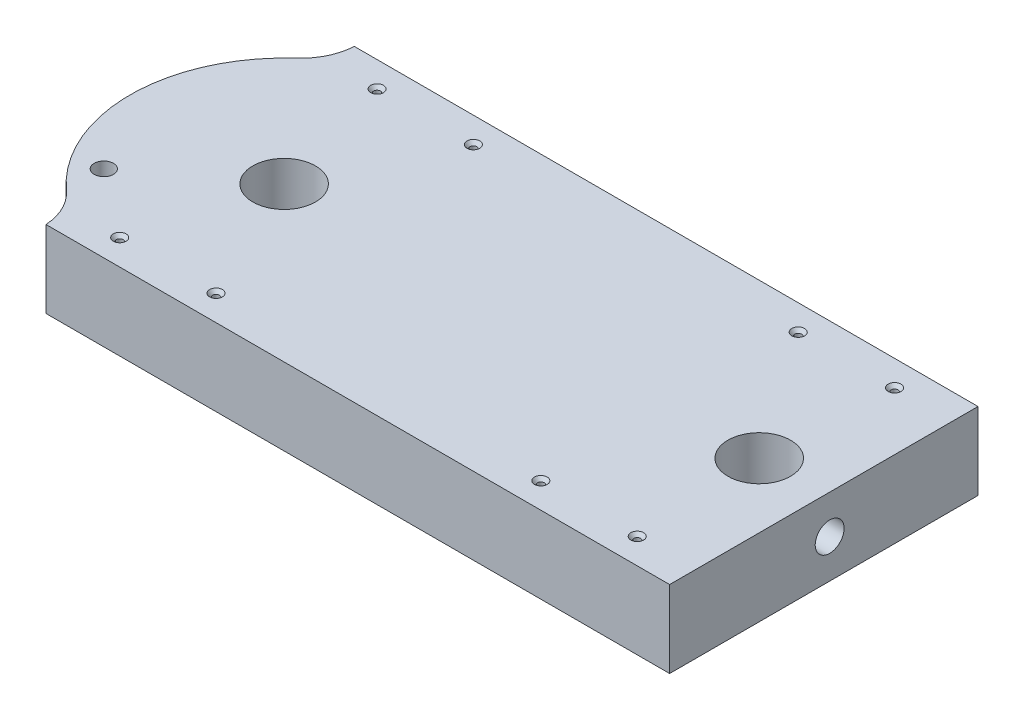
ISO-10303-21;
HEADER;
FILE_DESCRIPTION(('STEP AP214'),'2;1');
FILE_NAME('part.step','',(''),(''),'','','');
FILE_SCHEMA(('AUTOMOTIVE_DESIGN { 1 0 10303 214 1 1 1 1 }'));
ENDSEC;
DATA;
#1=APPLICATION_CONTEXT('core data for automotive mechanical design processes');
#2=APPLICATION_PROTOCOL_DEFINITION('international standard','automotive_design',2000,#1);
#3=PRODUCT_CONTEXT('',#1,'mechanical');
#4=PRODUCT('Part','Part','',(#3));
#5=PRODUCT_RELATED_PRODUCT_CATEGORY('part','',(#4));
#6=PRODUCT_DEFINITION_FORMATION('','',#4);
#7=PRODUCT_DEFINITION_CONTEXT('part definition',#1,'design');
#8=PRODUCT_DEFINITION('design','',#6,#7);
#9=PRODUCT_DEFINITION_SHAPE('','',#8);
#10=(LENGTH_UNIT() NAMED_UNIT(*) SI_UNIT(.MILLI.,.METRE.));
#11=(NAMED_UNIT(*) PLANE_ANGLE_UNIT() SI_UNIT($,.RADIAN.));
#12=(NAMED_UNIT(*) SI_UNIT($,.STERADIAN.) SOLID_ANGLE_UNIT());
#13=UNCERTAINTY_MEASURE_WITH_UNIT(LENGTH_MEASURE(1.E-05),#10,'distance_accuracy_value','');
#14=(GEOMETRIC_REPRESENTATION_CONTEXT(3) GLOBAL_UNCERTAINTY_ASSIGNED_CONTEXT((#13)) GLOBAL_UNIT_ASSIGNED_CONTEXT((#10,
#11,#12)) REPRESENTATION_CONTEXT('',''));
#15=CARTESIAN_POINT('',(0.,0.,0.));
#16=DIRECTION('',(0.,0.,1.));
#17=DIRECTION('',(1.,0.,0.));
#18=AXIS2_PLACEMENT_3D('',#15,#16,#17);
#19=CARTESIAN_POINT('',(-448.948604797529,50.8,205.533286209736));
#20=DIRECTION('',(0.,-1.,0.));
#21=DIRECTION('',(0.,0.,-1.));
#22=AXIS2_PLACEMENT_3D('',#19,#20,#21);
#23=CYLINDRICAL_SURFACE('',#22,38.1);
#24=CARTESIAN_POINT('',(-448.948604797529,0.,205.533286209736));
#25=DIRECTION('',(0.,1.,0.));
#26=DIRECTION('',(0.,0.,1.));
#27=AXIS2_PLACEMENT_3D('',#24,#25,#26);
#28=CIRCLE('',#27,38.1);
#29=CARTESIAN_POINT('',(-410.920118429236,0.,203.2));
#30=VERTEX_POINT('',#29);
#31=CARTESIAN_POINT('',(-423.489894398203,0.,177.187844516171));
#32=VERTEX_POINT('',#31);
#33=EDGE_CURVE('E126',#30,#32,#28,.T.);
#34=ORIENTED_EDGE('',*,*,#33,.F.);
#35=DIRECTION('',(0.,-1.,0.));
#36=VECTOR('',#35,1.);
#37=CARTESIAN_POINT('',(-410.920118429236,50.8,203.2));
#38=LINE('',#37,#36);
#39=CARTESIAN_POINT('',(-410.920118429236,50.8,203.2));
#40=VERTEX_POINT('',#39);
#41=EDGE_CURVE('E11',#40,#30,#38,.T.);
#42=ORIENTED_EDGE('',*,*,#41,.F.);
#43=CARTESIAN_POINT('',(-448.948604797529,50.8,205.533286209736));
#44=DIRECTION('',(0.,1.,0.));
#45=DIRECTION('',(0.,0.,1.));
#46=AXIS2_PLACEMENT_3D('',#43,#44,#45);
#47=CIRCLE('',#46,38.1);
#48=CARTESIAN_POINT('',(-423.489894398203,50.8,177.187844516171));
#49=VERTEX_POINT('',#48);
#50=EDGE_CURVE('E141',#40,#49,#47,.T.);
#51=ORIENTED_EDGE('',*,*,#50,.T.);
#52=DIRECTION('',(0.,-1.,0.));
#53=VECTOR('',#52,1.);
#54=CARTESIAN_POINT('',(-423.489894398203,50.8,177.187844516171));
#55=LINE('',#54,#53);
#56=EDGE_CURVE('E89',#49,#32,#55,.T.);
#57=ORIENTED_EDGE('',*,*,#56,.T.);
#58=EDGE_LOOP('',(#34,#42,#51,#57));
#59=FACE_BOUND('',#58,.T.);
#60=ADVANCED_FACE('F39',(#59),#23,.F.);
#61=CARTESIAN_POINT('',(0.,50.8,203.2));
#62=DIRECTION('',(0.,0.,1.));
#63=DIRECTION('',(1.,0.,0.));
#64=AXIS2_PLACEMENT_3D('',#61,#62,#63);
#65=PLANE('',#64);
#66=DIRECTION('',(-1.,0.,0.));
#67=VECTOR('',#66,1.);
#68=CARTESIAN_POINT('',(0.,0.,203.2));
#69=LINE('',#68,#67);
#70=CARTESIAN_POINT('',(0.,0.,203.2));
#71=VERTEX_POINT('',#70);
#72=EDGE_CURVE('E129',#71,#30,#69,.T.);
#73=ORIENTED_EDGE('',*,*,#72,.F.);
#74=DIRECTION('',(0.,-1.,0.));
#75=VECTOR('',#74,1.);
#76=CARTESIAN_POINT('',(0.,50.8,203.2));
#77=LINE('',#76,#75);
#78=CARTESIAN_POINT('',(0.,50.8,203.2));
#79=VERTEX_POINT('',#78);
#80=EDGE_CURVE('E53',#79,#71,#77,.T.);
#81=ORIENTED_EDGE('',*,*,#80,.F.);
#82=DIRECTION('',(-1.,0.,0.));
#83=VECTOR('',#82,1.);
#84=CARTESIAN_POINT('',(0.,50.8,203.2));
#85=LINE('',#84,#83);
#86=EDGE_CURVE('E155',#79,#40,#85,.T.);
#87=ORIENTED_EDGE('',*,*,#86,.T.);
#88=ORIENTED_EDGE('',*,*,#41,.T.);
#89=EDGE_LOOP('',(#73,#81,#87,#88));
#90=FACE_BOUND('',#89,.T.);
#91=ADVANCED_FACE('F151',(#90),#65,.T.);
#92=CARTESIAN_POINT('',(0.,50.8,0.));
#93=DIRECTION('',(1.,0.,0.));
#94=DIRECTION('',(0.,0.,-1.));
#95=AXIS2_PLACEMENT_3D('',#92,#93,#94);
#96=PLANE('',#95);
#97=CARTESIAN_POINT('',(0.,25.4,97.7392));
#98=DIRECTION('',(1.,0.,0.));
#99=DIRECTION('',(0.,0.,-1.));
#100=AXIS2_PLACEMENT_3D('',#97,#98,#99);
#101=CIRCLE('',#100,9.525);
#102=CARTESIAN_POINT('',(0.,25.4,88.2142));
#103=VERTEX_POINT('',#102);
#104=EDGE_CURVE('E248',#103,#103,#101,.T.);
#105=ORIENTED_EDGE('',*,*,#104,.F.);
#106=EDGE_LOOP('',(#105));
#107=FACE_BOUND('',#106,.T.);
#108=DIRECTION('',(0.,0.,1.));
#109=VECTOR('',#108,1.);
#110=CARTESIAN_POINT('',(0.,0.,0.));
#111=LINE('',#110,#109);
#112=CARTESIAN_POINT('',(0.,0.,0.));
#113=VERTEX_POINT('',#112);
#114=EDGE_CURVE('E133',#113,#71,#111,.T.);
#115=ORIENTED_EDGE('',*,*,#114,.F.);
#116=DIRECTION('',(0.,-1.,0.));
#117=VECTOR('',#116,1.);
#118=CARTESIAN_POINT('',(0.,50.8,0.));
#119=LINE('',#118,#117);
#120=CARTESIAN_POINT('',(0.,50.8,0.));
#121=VERTEX_POINT('',#120);
#122=EDGE_CURVE('E119',#121,#113,#119,.T.);
#123=ORIENTED_EDGE('',*,*,#122,.F.);
#124=DIRECTION('',(0.,0.,1.));
#125=VECTOR('',#124,1.);
#126=CARTESIAN_POINT('',(0.,50.8,0.));
#127=LINE('',#126,#125);
#128=EDGE_CURVE('E108',#121,#79,#127,.T.);
#129=ORIENTED_EDGE('',*,*,#128,.T.);
#130=ORIENTED_EDGE('',*,*,#80,.T.);
#131=EDGE_LOOP('',(#115,#123,#129,#130));
#132=FACE_BOUND('',#131,.T.);
#133=ADVANCED_FACE('F148',(#107,#132),#96,.T.);
#134=CARTESIAN_POINT('',(0.,50.8,0.));
#135=DIRECTION('',(0.,0.,1.));
#136=DIRECTION('',(1.,0.,0.));
#137=AXIS2_PLACEMENT_3D('',#134,#135,#136);
#138=PLANE('',#137);
#139=DIRECTION('',(-1.,0.,0.));
#140=VECTOR('',#139,1.);
#141=CARTESIAN_POINT('',(0.,0.,0.));
#142=LINE('',#141,#140);
#143=CARTESIAN_POINT('',(-410.920118429236,0.,0.));
#144=VERTEX_POINT('',#143);
#145=EDGE_CURVE('E115',#113,#144,#142,.T.);
#146=ORIENTED_EDGE('',*,*,#145,.T.);
#147=DIRECTION('',(0.,-1.,0.));
#148=VECTOR('',#147,1.);
#149=CARTESIAN_POINT('',(-410.920118429236,50.8,0.));
#150=LINE('',#149,#148);
#151=CARTESIAN_POINT('',(-410.920118429236,50.8,0.));
#152=VERTEX_POINT('',#151);
#153=EDGE_CURVE('E112',#152,#144,#150,.T.);
#154=ORIENTED_EDGE('',*,*,#153,.F.);
#155=DIRECTION('',(-1.,0.,0.));
#156=VECTOR('',#155,1.);
#157=CARTESIAN_POINT('',(0.,50.8,0.));
#158=LINE('',#157,#156);
#159=EDGE_CURVE('E101',#121,#152,#158,.T.);
#160=ORIENTED_EDGE('',*,*,#159,.F.);
#161=ORIENTED_EDGE('',*,*,#122,.T.);
#162=EDGE_LOOP('',(#146,#154,#160,#161));
#163=FACE_BOUND('',#162,.T.);
#164=ADVANCED_FACE('F113',(#163),#138,.F.);
#165=CARTESIAN_POINT('',(-448.948604797529,50.8,-2.33328620973551));
#166=DIRECTION('',(0.,-1.,0.));
#167=DIRECTION('',(0.,0.,-1.));
#168=AXIS2_PLACEMENT_3D('',#165,#166,#167);
#169=CYLINDRICAL_SURFACE('',#168,38.1);
#170=CARTESIAN_POINT('',(-448.948604797529,0.,-2.33328620973551));
#171=DIRECTION('',(0.,1.,0.));
#172=DIRECTION('',(0.,0.,1.));
#173=AXIS2_PLACEMENT_3D('',#170,#171,#172);
#174=CIRCLE('',#173,38.1);
#175=CARTESIAN_POINT('',(-423.489894398203,0.,26.0121554838287));
#176=VERTEX_POINT('',#175);
#177=EDGE_CURVE('E137',#176,#144,#174,.T.);
#178=ORIENTED_EDGE('',*,*,#177,.F.);
#179=DIRECTION('',(0.,-1.,0.));
#180=VECTOR('',#179,1.);
#181=CARTESIAN_POINT('',(-423.489894398203,50.8,26.0121554838287));
#182=LINE('',#181,#180);
#183=CARTESIAN_POINT('',(-423.489894398203,50.8,26.0121554838287));
#184=VERTEX_POINT('',#183);
#185=EDGE_CURVE('E82',#184,#176,#182,.T.);
#186=ORIENTED_EDGE('',*,*,#185,.F.);
#187=CARTESIAN_POINT('',(-448.948604797529,50.8,-2.33328620973551));
#188=DIRECTION('',(0.,1.,0.));
#189=DIRECTION('',(0.,0.,1.));
#190=AXIS2_PLACEMENT_3D('',#187,#188,#189);
#191=CIRCLE('',#190,38.1);
#192=EDGE_CURVE('E105',#184,#152,#191,.T.);
#193=ORIENTED_EDGE('',*,*,#192,.T.);
#194=ORIENTED_EDGE('',*,*,#153,.T.);
#195=EDGE_LOOP('',(#178,#186,#193,#194));
#196=FACE_BOUND('',#195,.T.);
#197=ADVANCED_FACE('F121',(#196),#169,.F.);
#198=CARTESIAN_POINT('',(-355.6,50.8,101.6));
#199=DIRECTION('',(0.,-1.,0.));
#200=DIRECTION('',(0.,0.,-1.));
#201=AXIS2_PLACEMENT_3D('',#198,#199,#200);
#202=CYLINDRICAL_SURFACE('',#201,101.6);
#203=CARTESIAN_POINT('',(-355.6,0.,101.6));
#204=DIRECTION('',(0.,1.,0.));
#205=DIRECTION('',(0.,0.,1.));
#206=AXIS2_PLACEMENT_3D('',#203,#204,#205);
#207=CIRCLE('',#206,101.6);
#208=EDGE_CURVE('E139',#176,#32,#207,.T.);
#209=ORIENTED_EDGE('',*,*,#208,.T.);
#210=ORIENTED_EDGE('',*,*,#56,.F.);
#211=CARTESIAN_POINT('',(-355.6,50.8,101.6));
#212=DIRECTION('',(0.,1.,0.));
#213=DIRECTION('',(0.,0.,1.));
#214=AXIS2_PLACEMENT_3D('',#211,#212,#213);
#215=CIRCLE('',#214,101.6);
#216=EDGE_CURVE('E61',#184,#49,#215,.T.);
#217=ORIENTED_EDGE('',*,*,#216,.F.);
#218=ORIENTED_EDGE('',*,*,#185,.T.);
#219=EDGE_LOOP('',(#209,#210,#217,#218));
#220=FACE_BOUND('',#219,.T.);
#221=ADVANCED_FACE('F154',(#220),#202,.T.);
#222=CARTESIAN_POINT('',(0.,50.8,0.));
#223=DIRECTION('',(0.,1.,0.));
#224=DIRECTION('',(0.,0.,1.));
#225=AXIS2_PLACEMENT_3D('',#222,#223,#224);
#226=PLANE('',#225);
#227=CARTESIAN_POINT('',(-42.545,50.8,101.6));
#228=DIRECTION('',(0.,1.,0.));
#229=DIRECTION('',(0.,0.,1.));
#230=AXIS2_PLACEMENT_3D('',#227,#228,#229);
#231=CIRCLE('',#230,20.6375);
#232=CARTESIAN_POINT('',(-42.545,50.8,122.2375));
#233=VERTEX_POINT('',#232);
#234=EDGE_CURVE('E243',#233,#233,#231,.T.);
#235=ORIENTED_EDGE('',*,*,#234,.F.);
#236=EDGE_LOOP('',(#235));
#237=FACE_BOUND('',#236,.T.);
#238=CARTESIAN_POINT('',(-355.6,50.8,101.6));
#239=DIRECTION('',(0.,1.,0.));
#240=DIRECTION('',(0.,0.,1.));
#241=AXIS2_PLACEMENT_3D('',#238,#239,#240);
#242=CIRCLE('',#241,20.6375);
#243=CARTESIAN_POINT('',(-355.6,50.8,122.2375));
#244=VERTEX_POINT('',#243);
#245=EDGE_CURVE('E237',#244,#244,#242,.T.);
#246=ORIENTED_EDGE('',*,*,#245,.F.);
#247=EDGE_LOOP('',(#246));
#248=FACE_BOUND('',#247,.T.);
#249=CARTESIAN_POINT('',(-423.620118429236,50.8,152.4));
#250=DIRECTION('',(0.,1.,0.));
#251=DIRECTION('',(0.,0.,1.));
#252=AXIS2_PLACEMENT_3D('',#249,#250,#251);
#253=CIRCLE('',#252,6.34999999999994);
#254=CARTESIAN_POINT('',(-423.620118429236,50.8,158.75));
#255=VERTEX_POINT('',#254);
#256=EDGE_CURVE('E231',#255,#255,#253,.T.);
#257=ORIENTED_EDGE('',*,*,#256,.F.);
#258=EDGE_LOOP('',(#257));
#259=FACE_BOUND('',#258,.T.);
#260=CARTESIAN_POINT('',(-38.1518815707644,50.8,16.8148));
#261=DIRECTION('',(0.,1.,0.));
#262=DIRECTION('',(0.,0.,1.));
#263=AXIS2_PLACEMENT_3D('',#260,#261,#262);
#264=CIRCLE('',#263,4.2164);
#265=CARTESIAN_POINT('',(-38.1518815707644,50.8,21.0312));
#266=VERTEX_POINT('',#265);
#267=EDGE_CURVE('E227',#266,#266,#264,.T.);
#268=ORIENTED_EDGE('',*,*,#267,.F.);
#269=EDGE_LOOP('',(#268));
#270=FACE_BOUND('',#269,.T.);
#271=CARTESIAN_POINT('',(-101.651881570764,50.8,16.8148000000001));
#272=DIRECTION('',(0.,1.,0.));
#273=DIRECTION('',(0.,0.,1.));
#274=AXIS2_PLACEMENT_3D('',#271,#272,#273);
#275=CIRCLE('',#274,4.21639999999999);
#276=CARTESIAN_POINT('',(-101.651881570764,50.8,21.0312000000001));
#277=VERTEX_POINT('',#276);
#278=EDGE_CURVE('E218',#277,#277,#275,.T.);
#279=ORIENTED_EDGE('',*,*,#278,.F.);
#280=EDGE_LOOP('',(#279));
#281=FACE_BOUND('',#280,.T.);
#282=CARTESIAN_POINT('',(-38.1518815707644,50.8,186.3852));
#283=DIRECTION('',(0.,1.,0.));
#284=DIRECTION('',(0.,0.,1.));
#285=AXIS2_PLACEMENT_3D('',#282,#283,#284);
#286=CIRCLE('',#285,4.2164);
#287=CARTESIAN_POINT('',(-38.1518815707644,50.8,190.6016));
#288=VERTEX_POINT('',#287);
#289=EDGE_CURVE('E209',#288,#288,#286,.T.);
#290=ORIENTED_EDGE('',*,*,#289,.F.);
#291=EDGE_LOOP('',(#290));
#292=FACE_BOUND('',#291,.T.);
#293=CARTESIAN_POINT('',(-101.651881570764,50.8,186.3852));
#294=DIRECTION('',(0.,1.,0.));
#295=DIRECTION('',(0.,0.,1.));
#296=AXIS2_PLACEMENT_3D('',#293,#294,#295);
#297=CIRCLE('',#296,4.21639999999999);
#298=CARTESIAN_POINT('',(-101.651881570764,50.8,190.6016));
#299=VERTEX_POINT('',#298);
#300=EDGE_CURVE('E200',#299,#299,#297,.T.);
#301=ORIENTED_EDGE('',*,*,#300,.F.);
#302=EDGE_LOOP('',(#301));
#303=FACE_BOUND('',#302,.T.);
#304=CARTESIAN_POINT('',(-379.170118429236,50.8,16.8148));
#305=DIRECTION('',(0.,1.,0.));
#306=DIRECTION('',(0.,0.,1.));
#307=AXIS2_PLACEMENT_3D('',#304,#305,#306);
#308=CIRCLE('',#307,4.21640000000001);
#309=CARTESIAN_POINT('',(-379.170118429236,50.8,21.0312));
#310=VERTEX_POINT('',#309);
#311=EDGE_CURVE('E191',#310,#310,#308,.T.);
#312=ORIENTED_EDGE('',*,*,#311,.F.);
#313=EDGE_LOOP('',(#312));
#314=FACE_BOUND('',#313,.T.);
#315=CARTESIAN_POINT('',(-315.670118429236,50.8,16.8148000000001));
#316=DIRECTION('',(0.,1.,0.));
#317=DIRECTION('',(0.,0.,1.));
#318=AXIS2_PLACEMENT_3D('',#315,#316,#317);
#319=CIRCLE('',#318,4.21640000000001);
#320=CARTESIAN_POINT('',(-315.670118429236,50.8,21.0312000000001));
#321=VERTEX_POINT('',#320);
#322=EDGE_CURVE('E182',#321,#321,#319,.T.);
#323=ORIENTED_EDGE('',*,*,#322,.F.);
#324=EDGE_LOOP('',(#323));
#325=FACE_BOUND('',#324,.T.);
#326=CARTESIAN_POINT('',(-379.170118429236,50.8,186.3852));
#327=DIRECTION('',(0.,1.,0.));
#328=DIRECTION('',(0.,0.,1.));
#329=AXIS2_PLACEMENT_3D('',#326,#327,#328);
#330=CIRCLE('',#329,4.21640000000001);
#331=CARTESIAN_POINT('',(-379.170118429236,50.8,190.6016));
#332=VERTEX_POINT('',#331);
#333=EDGE_CURVE('E173',#332,#332,#330,.T.);
#334=ORIENTED_EDGE('',*,*,#333,.F.);
#335=EDGE_LOOP('',(#334));
#336=FACE_BOUND('',#335,.T.);
#337=CARTESIAN_POINT('',(-315.670118429236,50.8,186.3852));
#338=DIRECTION('',(0.,1.,0.));
#339=DIRECTION('',(0.,0.,1.));
#340=AXIS2_PLACEMENT_3D('',#337,#338,#339);
#341=CIRCLE('',#340,4.21640000000001);
#342=CARTESIAN_POINT('',(-315.670118429236,50.8,190.6016));
#343=VERTEX_POINT('',#342);
#344=EDGE_CURVE('E164',#343,#343,#341,.T.);
#345=ORIENTED_EDGE('',*,*,#344,.F.);
#346=EDGE_LOOP('',(#345));
#347=FACE_BOUND('',#346,.T.);
#348=ORIENTED_EDGE('',*,*,#50,.F.);
#349=ORIENTED_EDGE('',*,*,#86,.F.);
#350=ORIENTED_EDGE('',*,*,#128,.F.);
#351=ORIENTED_EDGE('',*,*,#159,.T.);
#352=ORIENTED_EDGE('',*,*,#192,.F.);
#353=ORIENTED_EDGE('',*,*,#216,.T.);
#354=EDGE_LOOP('',(#348,#349,#350,#351,#352,#353));
#355=FACE_BOUND('',#354,.T.);
#356=ADVANCED_FACE('F103',(#237,#248,#259,#270,#281,#292,#303,#314,#325,#336,#347,#355),#226,.T.);
#357=CARTESIAN_POINT('',(0.,0.,0.));
#358=DIRECTION('',(0.,1.,0.));
#359=DIRECTION('',(0.,0.,1.));
#360=AXIS2_PLACEMENT_3D('',#357,#358,#359);
#361=PLANE('',#360);
#362=CARTESIAN_POINT('',(-42.545,0.,101.6));
#363=DIRECTION('',(0.,1.,0.));
#364=DIRECTION('',(0.,0.,1.));
#365=AXIS2_PLACEMENT_3D('',#362,#363,#364);
#366=CIRCLE('',#365,20.6375);
#367=CARTESIAN_POINT('',(-42.545,0.,122.2375));
#368=VERTEX_POINT('',#367);
#369=EDGE_CURVE('E240',#368,#368,#366,.T.);
#370=ORIENTED_EDGE('',*,*,#369,.T.);
#371=EDGE_LOOP('',(#370));
#372=FACE_BOUND('',#371,.T.);
#373=CARTESIAN_POINT('',(-355.6,0.,101.6));
#374=DIRECTION('',(0.,1.,0.));
#375=DIRECTION('',(0.,0.,1.));
#376=AXIS2_PLACEMENT_3D('',#373,#374,#375);
#377=CIRCLE('',#376,20.6375);
#378=CARTESIAN_POINT('',(-355.6,0.,122.2375));
#379=VERTEX_POINT('',#378);
#380=EDGE_CURVE('E234',#379,#379,#377,.T.);
#381=ORIENTED_EDGE('',*,*,#380,.T.);
#382=EDGE_LOOP('',(#381));
#383=FACE_BOUND('',#382,.T.);
#384=CARTESIAN_POINT('',(-423.620118429236,0.,152.4));
#385=DIRECTION('',(0.,1.,0.));
#386=DIRECTION('',(0.,0.,1.));
#387=AXIS2_PLACEMENT_3D('',#384,#385,#386);
#388=CIRCLE('',#387,6.34999999999994);
#389=CARTESIAN_POINT('',(-423.620118429236,0.,158.75));
#390=VERTEX_POINT('',#389);
#391=EDGE_CURVE('E230',#390,#390,#388,.T.);
#392=ORIENTED_EDGE('',*,*,#391,.T.);
#393=EDGE_LOOP('',(#392));
#394=FACE_BOUND('',#393,.T.);
#395=CARTESIAN_POINT('',(-38.1518815707644,0.,16.8148));
#396=DIRECTION('',(0.,1.,0.));
#397=DIRECTION('',(0.,0.,1.));
#398=AXIS2_PLACEMENT_3D('',#395,#396,#397);
#399=CIRCLE('',#398,2.24789999999998);
#400=CARTESIAN_POINT('',(-38.1518815707644,0.,19.0627));
#401=VERTEX_POINT('',#400);
#402=EDGE_CURVE('E221',#401,#401,#399,.T.);
#403=ORIENTED_EDGE('',*,*,#402,.T.);
#404=EDGE_LOOP('',(#403));
#405=FACE_BOUND('',#404,.T.);
#406=CARTESIAN_POINT('',(-101.651881570764,0.,16.8148000000001));
#407=DIRECTION('',(0.,1.,0.));
#408=DIRECTION('',(0.,0.,1.));
#409=AXIS2_PLACEMENT_3D('',#406,#407,#408);
#410=CIRCLE('',#409,2.24789999999998);
#411=CARTESIAN_POINT('',(-101.651881570764,0.,19.0627000000001));
#412=VERTEX_POINT('',#411);
#413=EDGE_CURVE('E212',#412,#412,#410,.T.);
#414=ORIENTED_EDGE('',*,*,#413,.T.);
#415=EDGE_LOOP('',(#414));
#416=FACE_BOUND('',#415,.T.);
#417=CARTESIAN_POINT('',(-38.1518815707644,0.,186.3852));
#418=DIRECTION('',(0.,1.,0.));
#419=DIRECTION('',(0.,0.,1.));
#420=AXIS2_PLACEMENT_3D('',#417,#418,#419);
#421=CIRCLE('',#420,2.24789999999998);
#422=CARTESIAN_POINT('',(-38.1518815707644,0.,188.6331));
#423=VERTEX_POINT('',#422);
#424=EDGE_CURVE('E203',#423,#423,#421,.T.);
#425=ORIENTED_EDGE('',*,*,#424,.T.);
#426=EDGE_LOOP('',(#425));
#427=FACE_BOUND('',#426,.T.);
#428=CARTESIAN_POINT('',(-101.651881570764,0.,186.3852));
#429=DIRECTION('',(0.,1.,0.));
#430=DIRECTION('',(0.,0.,1.));
#431=AXIS2_PLACEMENT_3D('',#428,#429,#430);
#432=CIRCLE('',#431,2.24789999999998);
#433=CARTESIAN_POINT('',(-101.651881570764,0.,188.6331));
#434=VERTEX_POINT('',#433);
#435=EDGE_CURVE('E194',#434,#434,#432,.T.);
#436=ORIENTED_EDGE('',*,*,#435,.T.);
#437=EDGE_LOOP('',(#436));
#438=FACE_BOUND('',#437,.T.);
#439=CARTESIAN_POINT('',(-379.170118429236,0.,16.8148));
#440=DIRECTION('',(0.,1.,0.));
#441=DIRECTION('',(0.,0.,1.));
#442=AXIS2_PLACEMENT_3D('',#439,#440,#441);
#443=CIRCLE('',#442,2.24789999999997);
#444=CARTESIAN_POINT('',(-379.170118429236,0.,19.0627));
#445=VERTEX_POINT('',#444);
#446=EDGE_CURVE('E185',#445,#445,#443,.T.);
#447=ORIENTED_EDGE('',*,*,#446,.T.);
#448=EDGE_LOOP('',(#447));
#449=FACE_BOUND('',#448,.T.);
#450=CARTESIAN_POINT('',(-315.670118429236,0.,16.8148000000001));
#451=DIRECTION('',(0.,1.,0.));
#452=DIRECTION('',(0.,0.,1.));
#453=AXIS2_PLACEMENT_3D('',#450,#451,#452);
#454=CIRCLE('',#453,2.24789999999997);
#455=CARTESIAN_POINT('',(-315.670118429236,0.,19.0627000000001));
#456=VERTEX_POINT('',#455);
#457=EDGE_CURVE('E176',#456,#456,#454,.T.);
#458=ORIENTED_EDGE('',*,*,#457,.T.);
#459=EDGE_LOOP('',(#458));
#460=FACE_BOUND('',#459,.T.);
#461=CARTESIAN_POINT('',(-379.170118429236,0.,186.3852));
#462=DIRECTION('',(0.,1.,0.));
#463=DIRECTION('',(0.,0.,1.));
#464=AXIS2_PLACEMENT_3D('',#461,#462,#463);
#465=CIRCLE('',#464,2.24789999999997);
#466=CARTESIAN_POINT('',(-379.170118429236,0.,188.6331));
#467=VERTEX_POINT('',#466);
#468=EDGE_CURVE('E167',#467,#467,#465,.T.);
#469=ORIENTED_EDGE('',*,*,#468,.T.);
#470=EDGE_LOOP('',(#469));
#471=FACE_BOUND('',#470,.T.);
#472=CARTESIAN_POINT('',(-315.670118429236,0.,186.3852));
#473=DIRECTION('',(0.,1.,0.));
#474=DIRECTION('',(0.,0.,1.));
#475=AXIS2_PLACEMENT_3D('',#472,#473,#474);
#476=CIRCLE('',#475,2.24789999999997);
#477=CARTESIAN_POINT('',(-315.670118429236,0.,188.6331));
#478=VERTEX_POINT('',#477);
#479=EDGE_CURVE('E130',#478,#478,#476,.T.);
#480=ORIENTED_EDGE('',*,*,#479,.T.);
#481=EDGE_LOOP('',(#480));
#482=FACE_BOUND('',#481,.T.);
#483=ORIENTED_EDGE('',*,*,#33,.T.);
#484=ORIENTED_EDGE('',*,*,#208,.F.);
#485=ORIENTED_EDGE('',*,*,#177,.T.);
#486=ORIENTED_EDGE('',*,*,#145,.F.);
#487=ORIENTED_EDGE('',*,*,#114,.T.);
#488=ORIENTED_EDGE('',*,*,#72,.T.);
#489=EDGE_LOOP('',(#483,#484,#485,#486,#487,#488));
#490=FACE_BOUND('',#489,.T.);
#491=ADVANCED_FACE('F153',(#372,#383,#394,#405,#416,#427,#438,#449,#460,#471,#482,#490),#361,.F.);
#492=CARTESIAN_POINT('',(-315.670118429236,50.8,186.3852));
#493=DIRECTION('',(0.,1.,0.));
#494=DIRECTION('',(0.,0.,1.));
#495=AXIS2_PLACEMENT_3D('',#492,#493,#494);
#496=CYLINDRICAL_SURFACE('',#495,2.24789999999997);
#497=ORIENTED_EDGE('',*,*,#479,.F.);
#498=EDGE_LOOP('',(#497));
#499=FACE_BOUND('',#498,.T.);
#500=CARTESIAN_POINT('',(-315.670118429236,48.5354997903854,186.3852));
#501=DIRECTION('',(0.,1.,0.));
#502=DIRECTION('',(0.,0.,1.));
#503=AXIS2_PLACEMENT_3D('',#500,#501,#502);
#504=CIRCLE('',#503,2.24789999999997);
#505=CARTESIAN_POINT('',(-315.670118429236,48.5354997903854,188.6331));
#506=VERTEX_POINT('',#505);
#507=EDGE_CURVE('E161',#506,#506,#504,.T.);
#508=ORIENTED_EDGE('',*,*,#507,.T.);
#509=EDGE_LOOP('',(#508));
#510=FACE_BOUND('',#509,.T.);
#511=ADVANCED_FACE('F283',(#499,#510),#496,.F.);
#512=CARTESIAN_POINT('',(-315.670118429236,50.8,186.3852));
#513=DIRECTION('',(0.,1.,0.));
#514=DIRECTION('',(0.,0.,1.));
#515=AXIS2_PLACEMENT_3D('',#512,#513,#514);
#516=CONICAL_SURFACE('',#515,4.21640000000001,0.715584993317684);
#517=ORIENTED_EDGE('',*,*,#507,.F.);
#518=EDGE_LOOP('',(#517));
#519=FACE_BOUND('',#518,.T.);
#520=ORIENTED_EDGE('',*,*,#344,.T.);
#521=EDGE_LOOP('',(#520));
#522=FACE_BOUND('',#521,.T.);
#523=ADVANCED_FACE('F290',(#519,#522),#516,.F.);
#524=CARTESIAN_POINT('',(-379.170118429236,50.8,186.3852));
#525=DIRECTION('',(0.,1.,0.));
#526=DIRECTION('',(0.,0.,1.));
#527=AXIS2_PLACEMENT_3D('',#524,#525,#526);
#528=CYLINDRICAL_SURFACE('',#527,2.24789999999997);
#529=ORIENTED_EDGE('',*,*,#468,.F.);
#530=EDGE_LOOP('',(#529));
#531=FACE_BOUND('',#530,.T.);
#532=CARTESIAN_POINT('',(-379.170118429236,48.5354997903854,186.3852));
#533=DIRECTION('',(0.,1.,0.));
#534=DIRECTION('',(0.,0.,1.));
#535=AXIS2_PLACEMENT_3D('',#532,#533,#534);
#536=CIRCLE('',#535,2.24789999999997);
#537=CARTESIAN_POINT('',(-379.170118429236,48.5354997903854,188.6331));
#538=VERTEX_POINT('',#537);
#539=EDGE_CURVE('E170',#538,#538,#536,.T.);
#540=ORIENTED_EDGE('',*,*,#539,.T.);
#541=EDGE_LOOP('',(#540));
#542=FACE_BOUND('',#541,.T.);
#543=ADVANCED_FACE('F294',(#531,#542),#528,.F.);
#544=CARTESIAN_POINT('',(-379.170118429236,50.8,186.3852));
#545=DIRECTION('',(0.,1.,0.));
#546=DIRECTION('',(0.,0.,1.));
#547=AXIS2_PLACEMENT_3D('',#544,#545,#546);
#548=CONICAL_SURFACE('',#547,4.21640000000001,0.715584993317684);
#549=ORIENTED_EDGE('',*,*,#539,.F.);
#550=EDGE_LOOP('',(#549));
#551=FACE_BOUND('',#550,.T.);
#552=ORIENTED_EDGE('',*,*,#333,.T.);
#553=EDGE_LOOP('',(#552));
#554=FACE_BOUND('',#553,.T.);
#555=ADVANCED_FACE('F298',(#551,#554),#548,.F.);
#556=CARTESIAN_POINT('',(-315.670118429236,50.8,16.8148000000001));
#557=DIRECTION('',(0.,1.,0.));
#558=DIRECTION('',(0.,0.,1.));
#559=AXIS2_PLACEMENT_3D('',#556,#557,#558);
#560=CYLINDRICAL_SURFACE('',#559,2.24789999999997);
#561=ORIENTED_EDGE('',*,*,#457,.F.);
#562=EDGE_LOOP('',(#561));
#563=FACE_BOUND('',#562,.T.);
#564=CARTESIAN_POINT('',(-315.670118429236,48.5354997903854,16.8148000000001));
#565=DIRECTION('',(0.,1.,0.));
#566=DIRECTION('',(0.,0.,1.));
#567=AXIS2_PLACEMENT_3D('',#564,#565,#566);
#568=CIRCLE('',#567,2.24789999999997);
#569=CARTESIAN_POINT('',(-315.670118429236,48.5354997903854,19.0627000000001));
#570=VERTEX_POINT('',#569);
#571=EDGE_CURVE('E179',#570,#570,#568,.T.);
#572=ORIENTED_EDGE('',*,*,#571,.T.);
#573=EDGE_LOOP('',(#572));
#574=FACE_BOUND('',#573,.T.);
#575=ADVANCED_FACE('F302',(#563,#574),#560,.F.);
#576=CARTESIAN_POINT('',(-315.670118429236,50.8,16.8148000000001));
#577=DIRECTION('',(0.,1.,0.));
#578=DIRECTION('',(0.,0.,1.));
#579=AXIS2_PLACEMENT_3D('',#576,#577,#578);
#580=CONICAL_SURFACE('',#579,4.21640000000001,0.715584993317684);
#581=ORIENTED_EDGE('',*,*,#571,.F.);
#582=EDGE_LOOP('',(#581));
#583=FACE_BOUND('',#582,.T.);
#584=ORIENTED_EDGE('',*,*,#322,.T.);
#585=EDGE_LOOP('',(#584));
#586=FACE_BOUND('',#585,.T.);
#587=ADVANCED_FACE('F306',(#583,#586),#580,.F.);
#588=CARTESIAN_POINT('',(-379.170118429236,50.8,16.8148));
#589=DIRECTION('',(0.,1.,0.));
#590=DIRECTION('',(0.,0.,1.));
#591=AXIS2_PLACEMENT_3D('',#588,#589,#590);
#592=CYLINDRICAL_SURFACE('',#591,2.24789999999997);
#593=ORIENTED_EDGE('',*,*,#446,.F.);
#594=EDGE_LOOP('',(#593));
#595=FACE_BOUND('',#594,.T.);
#596=CARTESIAN_POINT('',(-379.170118429236,48.5354997903854,16.8148));
#597=DIRECTION('',(0.,1.,0.));
#598=DIRECTION('',(0.,0.,1.));
#599=AXIS2_PLACEMENT_3D('',#596,#597,#598);
#600=CIRCLE('',#599,2.24789999999997);
#601=CARTESIAN_POINT('',(-379.170118429236,48.5354997903854,19.0627));
#602=VERTEX_POINT('',#601);
#603=EDGE_CURVE('E188',#602,#602,#600,.T.);
#604=ORIENTED_EDGE('',*,*,#603,.T.);
#605=EDGE_LOOP('',(#604));
#606=FACE_BOUND('',#605,.T.);
#607=ADVANCED_FACE('F310',(#595,#606),#592,.F.);
#608=CARTESIAN_POINT('',(-379.170118429236,50.8,16.8148));
#609=DIRECTION('',(0.,1.,0.));
#610=DIRECTION('',(0.,0.,1.));
#611=AXIS2_PLACEMENT_3D('',#608,#609,#610);
#612=CONICAL_SURFACE('',#611,4.21640000000001,0.715584993317684);
#613=ORIENTED_EDGE('',*,*,#603,.F.);
#614=EDGE_LOOP('',(#613));
#615=FACE_BOUND('',#614,.T.);
#616=ORIENTED_EDGE('',*,*,#311,.T.);
#617=EDGE_LOOP('',(#616));
#618=FACE_BOUND('',#617,.T.);
#619=ADVANCED_FACE('F314',(#615,#618),#612,.F.);
#620=CARTESIAN_POINT('',(-101.651881570764,50.8,186.3852));
#621=DIRECTION('',(0.,1.,0.));
#622=DIRECTION('',(0.,0.,1.));
#623=AXIS2_PLACEMENT_3D('',#620,#621,#622);
#624=CYLINDRICAL_SURFACE('',#623,2.24789999999999);
#625=ORIENTED_EDGE('',*,*,#435,.F.);
#626=EDGE_LOOP('',(#625));
#627=FACE_BOUND('',#626,.T.);
#628=CARTESIAN_POINT('',(-101.651881570764,48.5354997903854,186.3852));
#629=DIRECTION('',(0.,1.,0.));
#630=DIRECTION('',(0.,0.,1.));
#631=AXIS2_PLACEMENT_3D('',#628,#629,#630);
#632=CIRCLE('',#631,2.2479);
#633=CARTESIAN_POINT('',(-101.651881570764,48.5354997903854,188.6331));
#634=VERTEX_POINT('',#633);
#635=EDGE_CURVE('E197',#634,#634,#632,.T.);
#636=ORIENTED_EDGE('',*,*,#635,.T.);
#637=EDGE_LOOP('',(#636));
#638=FACE_BOUND('',#637,.T.);
#639=ADVANCED_FACE('F318',(#627,#638),#624,.F.);
#640=CARTESIAN_POINT('',(-101.651881570764,50.8,186.3852));
#641=DIRECTION('',(0.,1.,0.));
#642=DIRECTION('',(0.,0.,1.));
#643=AXIS2_PLACEMENT_3D('',#640,#641,#642);
#644=CONICAL_SURFACE('',#643,4.21639999999999,0.715584993317673);
#645=ORIENTED_EDGE('',*,*,#635,.F.);
#646=EDGE_LOOP('',(#645));
#647=FACE_BOUND('',#646,.T.);
#648=ORIENTED_EDGE('',*,*,#300,.T.);
#649=EDGE_LOOP('',(#648));
#650=FACE_BOUND('',#649,.T.);
#651=ADVANCED_FACE('F322',(#647,#650),#644,.F.);
#652=CARTESIAN_POINT('',(-38.1518815707644,50.8,186.3852));
#653=DIRECTION('',(0.,1.,0.));
#654=DIRECTION('',(0.,0.,1.));
#655=AXIS2_PLACEMENT_3D('',#652,#653,#654);
#656=CYLINDRICAL_SURFACE('',#655,2.24789999999999);
#657=ORIENTED_EDGE('',*,*,#424,.F.);
#658=EDGE_LOOP('',(#657));
#659=FACE_BOUND('',#658,.T.);
#660=CARTESIAN_POINT('',(-38.1518815707644,48.5354997903854,186.3852));
#661=DIRECTION('',(0.,1.,0.));
#662=DIRECTION('',(0.,0.,1.));
#663=AXIS2_PLACEMENT_3D('',#660,#661,#662);
#664=CIRCLE('',#663,2.24789999999999);
#665=CARTESIAN_POINT('',(-38.1518815707644,48.5354997903854,188.6331));
#666=VERTEX_POINT('',#665);
#667=EDGE_CURVE('E206',#666,#666,#664,.T.);
#668=ORIENTED_EDGE('',*,*,#667,.T.);
#669=EDGE_LOOP('',(#668));
#670=FACE_BOUND('',#669,.T.);
#671=ADVANCED_FACE('F326',(#659,#670),#656,.F.);
#672=CARTESIAN_POINT('',(-38.1518815707644,50.8,186.3852));
#673=DIRECTION('',(0.,1.,0.));
#674=DIRECTION('',(0.,0.,1.));
#675=AXIS2_PLACEMENT_3D('',#672,#673,#674);
#676=CONICAL_SURFACE('',#675,4.2164,0.715584993317677);
#677=ORIENTED_EDGE('',*,*,#667,.F.);
#678=EDGE_LOOP('',(#677));
#679=FACE_BOUND('',#678,.T.);
#680=ORIENTED_EDGE('',*,*,#289,.T.);
#681=EDGE_LOOP('',(#680));
#682=FACE_BOUND('',#681,.T.);
#683=ADVANCED_FACE('F330',(#679,#682),#676,.F.);
#684=CARTESIAN_POINT('',(-101.651881570764,50.8,16.8148000000001));
#685=DIRECTION('',(0.,1.,0.));
#686=DIRECTION('',(0.,0.,1.));
#687=AXIS2_PLACEMENT_3D('',#684,#685,#686);
#688=CYLINDRICAL_SURFACE('',#687,2.24789999999999);
#689=ORIENTED_EDGE('',*,*,#413,.F.);
#690=EDGE_LOOP('',(#689));
#691=FACE_BOUND('',#690,.T.);
#692=CARTESIAN_POINT('',(-101.651881570764,48.5354997903854,16.8148000000001));
#693=DIRECTION('',(0.,1.,0.));
#694=DIRECTION('',(0.,0.,1.));
#695=AXIS2_PLACEMENT_3D('',#692,#693,#694);
#696=CIRCLE('',#695,2.2479);
#697=CARTESIAN_POINT('',(-101.651881570764,48.5354997903854,19.0627000000001));
#698=VERTEX_POINT('',#697);
#699=EDGE_CURVE('E215',#698,#698,#696,.T.);
#700=ORIENTED_EDGE('',*,*,#699,.T.);
#701=EDGE_LOOP('',(#700));
#702=FACE_BOUND('',#701,.T.);
#703=ADVANCED_FACE('F334',(#691,#702),#688,.F.);
#704=CARTESIAN_POINT('',(-101.651881570764,50.8,16.8148000000001));
#705=DIRECTION('',(0.,1.,0.));
#706=DIRECTION('',(0.,0.,1.));
#707=AXIS2_PLACEMENT_3D('',#704,#705,#706);
#708=CONICAL_SURFACE('',#707,4.21639999999999,0.715584993317673);
#709=ORIENTED_EDGE('',*,*,#699,.F.);
#710=EDGE_LOOP('',(#709));
#711=FACE_BOUND('',#710,.T.);
#712=ORIENTED_EDGE('',*,*,#278,.T.);
#713=EDGE_LOOP('',(#712));
#714=FACE_BOUND('',#713,.T.);
#715=ADVANCED_FACE('F338',(#711,#714),#708,.F.);
#716=CARTESIAN_POINT('',(-38.1518815707644,50.8,16.8148));
#717=DIRECTION('',(0.,1.,0.));
#718=DIRECTION('',(0.,0.,1.));
#719=AXIS2_PLACEMENT_3D('',#716,#717,#718);
#720=CYLINDRICAL_SURFACE('',#719,2.24789999999999);
#721=ORIENTED_EDGE('',*,*,#402,.F.);
#722=EDGE_LOOP('',(#721));
#723=FACE_BOUND('',#722,.T.);
#724=CARTESIAN_POINT('',(-38.1518815707644,48.5354997903854,16.8148));
#725=DIRECTION('',(0.,1.,0.));
#726=DIRECTION('',(0.,0.,1.));
#727=AXIS2_PLACEMENT_3D('',#724,#725,#726);
#728=CIRCLE('',#727,2.24789999999999);
#729=CARTESIAN_POINT('',(-38.1518815707644,48.5354997903854,19.0627));
#730=VERTEX_POINT('',#729);
#731=EDGE_CURVE('E224',#730,#730,#728,.T.);
#732=ORIENTED_EDGE('',*,*,#731,.T.);
#733=EDGE_LOOP('',(#732));
#734=FACE_BOUND('',#733,.T.);
#735=ADVANCED_FACE('F342',(#723,#734),#720,.F.);
#736=CARTESIAN_POINT('',(-38.1518815707644,50.8,16.8148));
#737=DIRECTION('',(0.,1.,0.));
#738=DIRECTION('',(0.,0.,1.));
#739=AXIS2_PLACEMENT_3D('',#736,#737,#738);
#740=CONICAL_SURFACE('',#739,4.2164,0.715584993317677);
#741=ORIENTED_EDGE('',*,*,#731,.F.);
#742=EDGE_LOOP('',(#741));
#743=FACE_BOUND('',#742,.T.);
#744=ORIENTED_EDGE('',*,*,#267,.T.);
#745=EDGE_LOOP('',(#744));
#746=FACE_BOUND('',#745,.T.);
#747=ADVANCED_FACE('F346',(#743,#746),#740,.F.);
#748=CARTESIAN_POINT('',(-423.620118429236,0.,152.4));
#749=DIRECTION('',(0.,1.,0.));
#750=DIRECTION('',(0.,0.,1.));
#751=AXIS2_PLACEMENT_3D('',#748,#749,#750);
#752=CYLINDRICAL_SURFACE('',#751,6.34999999999994);
#753=ORIENTED_EDGE('',*,*,#391,.F.);
#754=EDGE_LOOP('',(#753));
#755=FACE_BOUND('',#754,.T.);
#756=ORIENTED_EDGE('',*,*,#256,.T.);
#757=EDGE_LOOP('',(#756));
#758=FACE_BOUND('',#757,.T.);
#759=ADVANCED_FACE('F350',(#755,#758),#752,.F.);
#760=CARTESIAN_POINT('',(-355.6,0.,101.6));
#761=DIRECTION('',(0.,1.,0.));
#762=DIRECTION('',(0.,0.,1.));
#763=AXIS2_PLACEMENT_3D('',#760,#761,#762);
#764=CYLINDRICAL_SURFACE('',#763,20.6375);
#765=ORIENTED_EDGE('',*,*,#380,.F.);
#766=EDGE_LOOP('',(#765));
#767=FACE_BOUND('',#766,.T.);
#768=ORIENTED_EDGE('',*,*,#245,.T.);
#769=EDGE_LOOP('',(#768));
#770=FACE_BOUND('',#769,.T.);
#771=ADVANCED_FACE('F263',(#767,#770),#764,.F.);
#772=CARTESIAN_POINT('',(-42.545,0.,101.6));
#773=DIRECTION('',(0.,1.,0.));
#774=DIRECTION('',(0.,0.,1.));
#775=AXIS2_PLACEMENT_3D('',#772,#773,#774);
#776=CYLINDRICAL_SURFACE('',#775,20.6375);
#777=CARTESIAN_POINT('',(-26.8374615356192,25.4,88.2142));
#778=CARTESIAN_POINT('',(-26.8374626980459,25.6311706415493,88.2141992080606));
#779=CARTESIAN_POINT('',(-26.830266103646,25.8623316277521,88.2226298635802));
#780=CARTESIAN_POINT('',(-26.8017656457958,26.3226509796652,88.2561826886187));
#781=CARTESIAN_POINT('',(-26.7804559360929,26.5518084755695,88.2813117753526));
#782=CARTESIAN_POINT('',(-26.7245013678337,27.0064202019947,88.3478263106509));
#783=CARTESIAN_POINT('',(-26.6898372124187,27.2318685791027,88.3892352850517));
#784=CARTESIAN_POINT('',(-26.6083900961665,27.6771972438754,88.4876035414694));
#785=CARTESIAN_POINT('',(-26.5616012349656,27.8970747631898,88.5445703952983));
#786=CARTESIAN_POINT('',(-26.4578587588501,28.3279544974288,88.6726258755404));
#787=CARTESIAN_POINT('',(-26.4009993867517,28.5390183177979,88.7435842089949));
#788=CARTESIAN_POINT('',(-26.278383034303,28.9534380848202,88.8990784262355));
#789=CARTESIAN_POINT('',(-26.2126224336797,29.1567908519592,88.9836198371076));
#790=CARTESIAN_POINT('',(-26.00434986989,29.7541328968379,89.2563614868637));
#791=CARTESIAN_POINT('',(-25.8507580240494,30.1357576517416,89.4637855840233));
#792=CARTESIAN_POINT('',(-25.5964641610059,30.7038833060646,89.8237936743878));
#793=CARTESIAN_POINT('',(-25.5017449756379,30.9031746763594,89.9610976909503));
#794=CARTESIAN_POINT('',(-25.3083570695355,31.2896146339932,90.2494651431552));
#795=CARTESIAN_POINT('',(-25.2096881567495,31.4767626297106,90.4005292483247));
#796=CARTESIAN_POINT('',(-25.0100314838028,31.8385478044545,90.7157850811972));
#797=CARTESIAN_POINT('',(-24.9090422329497,32.0131766259717,90.8799854264272));
#798=CARTESIAN_POINT('',(-24.7063172334101,32.349374214049,91.2208320299385));
#799=CARTESIAN_POINT('',(-24.6045814509389,32.5109423855197,91.3974788546399));
#800=CARTESIAN_POINT('',(-24.3827243683029,32.8495770134419,91.7969562491487));
#801=CARTESIAN_POINT('',(-24.2627367633838,33.0238593901117,92.0222316322092));
#802=CARTESIAN_POINT('',(-24.0258853565011,33.3522574372881,92.4886214871007));
#803=CARTESIAN_POINT('',(-23.9090219311693,33.5063706849754,92.7297378566166));
#804=CARTESIAN_POINT('',(-23.6804649223337,33.7932219571189,93.2267955908719));
#805=CARTESIAN_POINT('',(-23.5687724155081,33.9259555440824,93.4827400183245));
#806=CARTESIAN_POINT('',(-23.3525405172926,34.1686034069581,94.0081240229849));
#807=CARTESIAN_POINT('',(-23.2480006440436,34.2785192210764,94.2775626889896));
#808=CARTESIAN_POINT('',(-23.0495541196759,34.4724082753707,94.8237905110148));
#809=CARTESIAN_POINT('',(-22.9554997421999,34.5567819419688,95.1003833526024));
#810=CARTESIAN_POINT('',(-22.7776460351375,34.7005556350099,95.6632324986388));
#811=CARTESIAN_POINT('',(-22.6938468398414,34.7599553344472,95.9494889295684));
#812=CARTESIAN_POINT('',(-22.5379533951026,34.8523647529531,96.5290589020441));
#813=CARTESIAN_POINT('',(-22.4658471854014,34.8854015748924,96.8223648756739));
#814=CARTESIAN_POINT('',(-22.3343103274651,34.9240385680924,97.4135837311891));
#815=CARTESIAN_POINT('',(-22.2748775990327,34.9296432453256,97.7114958484094));
#816=CARTESIAN_POINT('',(-22.1762117251392,34.9137504269431,98.2700487689356));
#817=CARTESIAN_POINT('',(-22.135357742822,34.8956777425025,98.5305060015074));
#818=CARTESIAN_POINT('',(-22.0639135673474,34.8379394983665,99.050425372855));
#819=CARTESIAN_POINT('',(-22.0333223952378,34.7982759991298,99.309887604207));
#820=CARTESIAN_POINT('',(-21.9822962578169,34.6974110721291,99.8255309835667));
#821=CARTESIAN_POINT('',(-21.9618586955737,34.6362151584375,100.081712954201));
#822=CARTESIAN_POINT('',(-21.9307308577943,34.4926114552211,100.588663063342));
#823=CARTESIAN_POINT('',(-21.9200403804034,34.4102041050144,100.839431313857));
#824=CARTESIAN_POINT('',(-21.908165148143,34.2311621096758,101.316429207442));
#825=CARTESIAN_POINT('',(-21.9063768359464,34.135896902063,101.543159903763));
#826=CARTESIAN_POINT('',(-21.9099565129099,33.9281077543938,101.988602327455));
#827=CARTESIAN_POINT('',(-21.9153269472567,33.8155779289448,102.207311288649));
#828=CARTESIAN_POINT('',(-21.9323639751585,33.574102453127,102.635115880444));
#829=CARTESIAN_POINT('',(-21.9440286625051,33.4451617817959,102.844214400763));
#830=CARTESIAN_POINT('',(-21.9726842469133,33.1716602671071,103.251654237551));
#831=CARTESIAN_POINT('',(-21.9896772067018,33.0270933886237,103.449991353032));
#832=CARTESIAN_POINT('',(-22.0285854992901,32.718136680371,103.841226594998));
#833=CARTESIAN_POINT('',(-22.0506488214801,32.5532392670405,104.033709147187));
#834=CARTESIAN_POINT('',(-22.098127905788,32.208793472978,104.404788915084));
#835=CARTESIAN_POINT('',(-22.1235451606701,32.0292385821647,104.583379891356));
#836=CARTESIAN_POINT('',(-22.176472712465,31.656640158508,104.925580649162));
#837=CARTESIAN_POINT('',(-22.2039831959333,31.4635954235305,105.089189092533));
#838=CARTESIAN_POINT('',(-22.2598393946515,31.0651802801255,105.400484021151));
#839=CARTESIAN_POINT('',(-22.2881851339146,30.8598095171547,105.548170048067));
#840=CARTESIAN_POINT('',(-22.3460776962821,30.4259522926333,105.834679152328));
#841=CARTESIAN_POINT('',(-22.3756013820531,30.1968154254954,105.972523502983));
#842=CARTESIAN_POINT('',(-22.4328005776369,29.7276709329441,106.228503345165));
#843=CARTESIAN_POINT('',(-22.460476734454,29.4876671630594,106.346645758252));
#844=CARTESIAN_POINT('',(-22.5127105014379,28.9982026362172,106.562471537179));
#845=CARTESIAN_POINT('',(-22.537267106832,28.7487388657242,106.660148317813));
#846=CARTESIAN_POINT('',(-22.5820941456847,28.2422229746077,106.834202711935));
#847=CARTESIAN_POINT('',(-22.6023663430056,27.985174026617,106.910589094685));
#848=CARTESIAN_POINT('',(-22.6376374692526,27.4658655334518,107.041314403236));
#849=CARTESIAN_POINT('',(-22.6526496423388,27.203620857435,107.095708756527));
#850=CARTESIAN_POINT('',(-22.6767602698591,26.6752114255084,107.182246870496));
#851=CARTESIAN_POINT('',(-22.6858587185734,26.4090466658072,107.214390609653));
#852=CARTESIAN_POINT('',(-22.697705041615,25.874868489248,107.256126065848));
#853=CARTESIAN_POINT('',(-22.7004542454486,25.606855471199,107.265722504206));
#854=CARTESIAN_POINT('',(-22.6994732964376,25.070990753767,107.262285850178));
#855=CARTESIAN_POINT('',(-22.6957433073928,24.8031390504771,107.249253329871));
#856=CARTESIAN_POINT('',(-22.6822234551195,24.2788981893011,107.201526317825));
#857=CARTESIAN_POINT('',(-22.6726479352876,24.02243331998,107.167597669281));
#858=CARTESIAN_POINT('',(-22.6480553904685,23.5133718726005,107.079060967558));
#859=CARTESIAN_POINT('',(-22.6330384953702,23.2607752023556,107.024453407996));
#860=CARTESIAN_POINT('',(-22.5982264945985,22.7611783934287,106.895008724077));
#861=CARTESIAN_POINT('',(-22.5784316607397,22.5141779372548,106.820172750475));
#862=CARTESIAN_POINT('',(-22.5349189906078,22.0272769600117,106.650812200261));
#863=CARTESIAN_POINT('',(-22.5111996392421,21.7873792233404,106.556280016095));
#864=CARTESIAN_POINT('',(-22.4605355281695,21.3131535467792,106.346835652163));
#865=CARTESIAN_POINT('',(-22.4335520795702,21.0789420593379,106.231669231992));
#866=CARTESIAN_POINT('',(-22.3778027797492,20.6208138786513,105.982562328714));
#867=CARTESIAN_POINT('',(-22.3490361271661,20.3969018938442,105.848613370216));
#868=CARTESIAN_POINT('',(-22.2910163809666,19.9608061170896,105.562803858774));
#869=CARTESIAN_POINT('',(-22.2617631723354,19.7486251509523,105.410939017558));
#870=CARTESIAN_POINT('',(-22.2041410892602,19.3374503352396,105.090325972057));
#871=CARTESIAN_POINT('',(-22.175771835546,19.1384507875977,104.921585143154));
#872=CARTESIAN_POINT('',(-22.1203870244216,18.7485017833548,104.562377281725));
#873=CARTESIAN_POINT('',(-22.0934463383276,18.5580301285703,104.371379335991));
#874=CARTESIAN_POINT('',(-22.0434870147464,18.1938108053172,103.973711258953));
#875=CARTESIAN_POINT('',(-22.0204668179032,18.0200564996225,103.767047406175));
#876=CARTESIAN_POINT('',(-21.979807520153,17.6904838991154,103.339366566213));
#877=CARTESIAN_POINT('',(-21.9621685036245,17.5346658855729,103.11834935403));
#878=CARTESIAN_POINT('',(-21.9336642023011,17.2422134953026,102.663550324516));
#879=CARTESIAN_POINT('',(-21.9227986246677,17.1055782894352,102.429769059494));
#880=CARTESIAN_POINT('',(-21.9093015430849,16.8563294277311,101.958244349787));
#881=CARTESIAN_POINT('',(-21.9064381200471,16.7431292642159,101.72081766962));
#882=CARTESIAN_POINT('',(-21.9092697445198,16.5367664295488,101.237451654032));
#883=CARTESIAN_POINT('',(-21.9149646425722,16.443603408511,100.991512467342));
#884=CARTESIAN_POINT('',(-21.9356912505763,16.2780559578481,100.493225846884));
#885=CARTESIAN_POINT('',(-21.9507192040464,16.2056631854909,100.240881030505));
#886=CARTESIAN_POINT('',(-21.9906454708729,16.0820779960386,99.7318235251166));
#887=CARTESIAN_POINT('',(-22.0155433477872,16.0308846417223,99.4751110297234));
#888=CARTESIAN_POINT('',(-22.0737280702129,15.9522458551788,98.9745093800523));
#889=CARTESIAN_POINT('',(-22.1064431377056,15.9235929515331,98.7307422537125));
#890=CARTESIAN_POINT('',(-22.1808532696016,15.8851947680858,98.243102871288));
#891=CARTESIAN_POINT('',(-22.2225479249798,15.8754486272732,97.9992306204966));
#892=CARTESIAN_POINT('',(-22.3147015908387,15.8745816134491,97.5131134839552));
#893=CARTESIAN_POINT('',(-22.3651610041358,15.8834615966767,97.2708686735319));
#894=CARTESIAN_POINT('',(-22.4744319864424,15.9193787457914,96.7896367793795));
#895=CARTESIAN_POINT('',(-22.5332437845602,15.9464164098245,96.5506497852105));
#896=CARTESIAN_POINT('',(-22.6593834907604,16.0184552958595,96.0746027877758));
#897=CARTESIAN_POINT('',(-22.726803916045,16.0636652483747,95.8375990291927));
#898=CARTESIAN_POINT('',(-22.8688647198441,16.1712945688912,95.3697609319409));
#899=CARTESIAN_POINT('',(-22.943505095104,16.2337139291348,95.1389265904912));
#900=CARTESIAN_POINT('',(-23.099157243644,16.374956224123,94.6845624080402));
#901=CARTESIAN_POINT('',(-23.1801688470545,16.4537787216197,94.4610323725163));
#902=CARTESIAN_POINT('',(-23.3476641077654,16.6270410952905,94.0221439961677));
#903=CARTESIAN_POINT('',(-23.4341497404484,16.7214866293296,93.8067886506634));
#904=CARTESIAN_POINT('',(-23.6206923046381,16.9356519937496,93.363459827126));
#905=CARTESIAN_POINT('',(-23.7212309382585,17.0569711833255,93.1364609862139));
#906=CARTESIAN_POINT('',(-23.9263676396245,17.3166903093221,92.6942500021741));
#907=CARTESIAN_POINT('',(-24.0309675140084,17.4550979085889,92.4790432097886));
#908=CARTESIAN_POINT('',(-24.2428039508833,17.7482153838255,92.0610816153994));
#909=CARTESIAN_POINT('',(-24.3500427764658,17.9029396545535,91.8583380624271));
#910=CARTESIAN_POINT('',(-24.5655014696963,18.2278441999291,91.4661902220458));
#911=CARTESIAN_POINT('',(-24.673721391399,18.3980253309079,91.2767866747249));
#912=CARTESIAN_POINT('',(-24.902398051237,18.7745072333518,90.8901309817508));
#913=CARTESIAN_POINT('',(-25.0227676320231,18.9826927079009,90.6946567678486));
#914=CARTESIAN_POINT('',(-25.2600866861964,19.4169597076256,90.3222813493301));
#915=CARTESIAN_POINT('',(-25.3770355119409,19.6430445919995,90.1453836455448));
#916=CARTESIAN_POINT('',(-25.6045190965333,20.112185004555,89.8115619508638));
#917=CARTESIAN_POINT('',(-25.7150598728451,20.3552241232587,89.6546190505621));
#918=CARTESIAN_POINT('',(-25.9266725134652,20.8577974835869,89.3619358134374));
#919=CARTESIAN_POINT('',(-26.0277431607566,21.117333838116,89.226198200238));
#920=CARTESIAN_POINT('',(-26.1921333097834,21.5819746117631,89.0101832845417));
#921=CARTESIAN_POINT('',(-26.2584217954482,21.7836111214049,88.9246764295564));
#922=CARTESIAN_POINT('',(-26.3823337031417,22.1946113496955,88.7670473391456));
#923=CARTESIAN_POINT('',(-26.4399592999962,22.4039731124193,88.694921743275));
#924=CARTESIAN_POINT('',(-26.5449037171058,22.8290839550154,88.5650357685584));
#925=CARTESIAN_POINT('',(-26.5922463572138,23.0448169293164,88.507242145535));
#926=CARTESIAN_POINT('',(-26.6753448196057,23.481867451057,88.4066413343055));
#927=CARTESIAN_POINT('',(-26.7111051528185,23.7031827880632,88.3638283111236));
#928=CARTESIAN_POINT('',(-26.772317514431,24.1687921001688,88.2909289259605));
#929=CARTESIAN_POINT('',(-26.7966490428795,24.4134526937471,88.2622164725763));
#930=CARTESIAN_POINT('',(-26.8292226106729,24.9054120768848,88.2238498521889));
#931=CARTESIAN_POINT('',(-26.8374602921452,25.152711562779,88.2142008471554));
#932=CARTESIAN_POINT('',(-26.8374615356192,25.4,88.2142));
#933=B_SPLINE_CURVE_WITH_KNOTS('',3,(#777,#778,#779,#780,#781,#782,#783,#784,#785,#786,#787,
#788,#789,#790,#791,#792,#793,#794,#795,#796,#797,#798,#799,#800,#801,#802,#803,#804,#805,#806,
#807,#808,#809,#810,#811,#812,#813,#814,#815,#816,#817,#818,#819,#820,#821,#822,#823,#824,#825,
#826,#827,#828,#829,#830,#831,#832,#833,#834,#835,#836,#837,#838,#839,#840,#841,#842,#843,#844,
#845,#846,#847,#848,#849,#850,#851,#852,#853,#854,#855,#856,#857,#858,#859,#860,#861,#862,#863,
#864,#865,#866,#867,#868,#869,#870,#871,#872,#873,#874,#875,#876,#877,#878,#879,#880,#881,#882,
#883,#884,#885,#886,#887,#888,#889,#890,#891,#892,#893,#894,#895,#896,#897,#898,#899,#900,#901,
#902,#903,#904,#905,#906,#907,#908,#909,#910,#911,#912,#913,#914,#915,#916,#917,#918,#919,#920,
#921,#922,#923,#924,#925,#926,#927,#928,#929,#930,#931,#932),.UNSPECIFIED.,.T.,.F.,(4,2,2,2,2,2,
2,2,2,2,2,2,2,2,2,2,2,2,2,2,2,2,2,2,2,2,2,2,2,2,2,2,2,2,2,2,2,2,2,2,2,2,2,2,2,2,2,2,2,2,2,2,2,2,
2,2,2,2,2,2,2,2,2,2,2,2,2,2,2,2,2,2,2,2,2,2,2,4),(0.,0.693233818955324,1.38675498461395,
2.08128205360626,2.77614774386212,3.46482468385222,4.15378256620512,5.53057506894998,
6.30971858918549,7.08890004061297,7.86859690294971,8.64832927103403,9.5744321293392,
10.5006461339589,11.4270521335026,12.3533956612861,13.2643590569006,14.1753343801791,
15.0853719465517,15.9952600261865,16.7869957817754,17.5786559935319,18.3701136224085,
19.1615548604242,19.8985285547864,20.6357540390558,21.3727563805286,22.1100443897294,
22.8724535588249,23.6352032118757,24.3980209234976,25.160860587163,25.9669950400255,
26.7728456874684,27.5789552358349,28.3847322649747,29.1884656054211,29.9921997232457,
30.7957655271231,31.5993110164285,32.3750275871449,33.1507256422395,33.926379578634,
34.7023336643719,35.488603955143,36.2752301894363,37.0620450908287,37.8485176175553,
38.6607740376889,39.4727066283153,40.2846519496154,41.0965621653496,41.8846846173107,
42.6727933060637,43.4605849926447,44.2483418474276,44.990306749819,45.7322378624529,
46.4742030822543,47.2161886582991,47.9669521598753,48.7177153230262,49.4684584761269,
50.219474107636,51.0475977576284,51.8760941158214,52.7053275965915,53.5346070460928,
54.463231224884,55.3920300944072,56.3199421575249,57.2479733045722,57.9338482375085,
58.6195506923472,59.3036474057986,59.9874773647211,60.7288444617854,61.4704122775307),.UNSPECIFIED.);
#934=CARTESIAN_POINT('',(-26.8374615356192,25.4,88.2142));
#935=VERTEX_POINT('',#934);
#936=EDGE_CURVE('E42',#935,#935,#933,.T.);
#937=ORIENTED_EDGE('',*,*,#936,.T.);
#938=EDGE_LOOP('',(#937));
#939=FACE_BOUND('',#938,.T.);
#940=ORIENTED_EDGE('',*,*,#369,.F.);
#941=EDGE_LOOP('',(#940));
#942=FACE_BOUND('',#941,.T.);
#943=ORIENTED_EDGE('',*,*,#234,.T.);
#944=EDGE_LOOP('',(#943));
#945=FACE_BOUND('',#944,.T.);
#946=ADVANCED_FACE('F255',(#939,#942,#945),#776,.F.);
#947=CARTESIAN_POINT('',(0.,25.4,97.7392));
#948=DIRECTION('',(1.,0.,0.));
#949=DIRECTION('',(0.,0.,-1.));
#950=AXIS2_PLACEMENT_3D('',#947,#948,#949);
#951=CYLINDRICAL_SURFACE('',#950,9.525);
#952=ORIENTED_EDGE('',*,*,#104,.T.);
#953=EDGE_LOOP('',(#952));
#954=FACE_BOUND('',#953,.T.);
#955=ORIENTED_EDGE('',*,*,#936,.F.);
#956=EDGE_LOOP('',(#955));
#957=FACE_BOUND('',#956,.T.);
#958=ADVANCED_FACE('F258',(#954,#957),#951,.F.);
#959=CLOSED_SHELL('',(#60,#91,#133,#164,#197,#221,#356,#491,#511,#523,#543,#555,#575,#587,#607,
#619,#639,#651,#671,#683,#703,#715,#735,#747,#759,#771,#946,#958));
#960=MANIFOLD_SOLID_BREP('B2',#959);
#961=ADVANCED_BREP_SHAPE_REPRESENTATION('',(#18,#960),#14);
#962=SHAPE_DEFINITION_REPRESENTATION(#9,#961);
ENDSEC;
END-ISO-10303-21;
